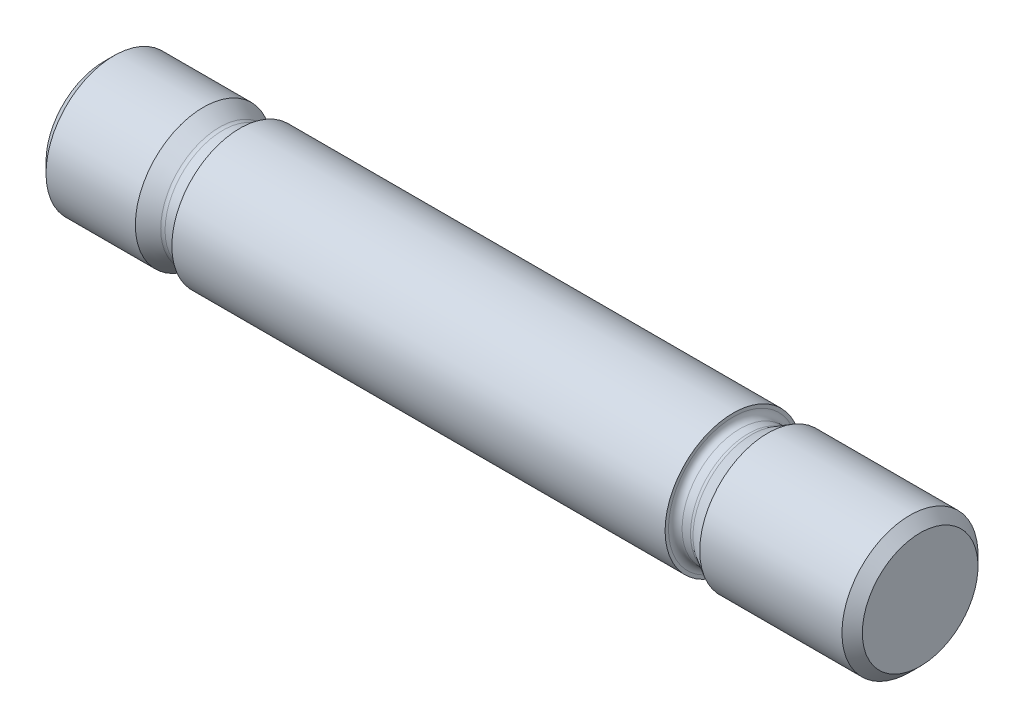
ISO-10303-21;
HEADER;
FILE_DESCRIPTION(('STEP AP214'),'2;1');
FILE_NAME('part.step','',(''),(''),'','','');
FILE_SCHEMA(('AUTOMOTIVE_DESIGN { 1 0 10303 214 1 1 1 1 }'));
ENDSEC;
DATA;
#1=APPLICATION_CONTEXT('core data for automotive mechanical design processes');
#2=APPLICATION_PROTOCOL_DEFINITION('international standard','automotive_design',2000,#1);
#3=PRODUCT_CONTEXT('',#1,'mechanical');
#4=PRODUCT('Part','Part','',(#3));
#5=PRODUCT_RELATED_PRODUCT_CATEGORY('part','',(#4));
#6=PRODUCT_DEFINITION_FORMATION('','',#4);
#7=PRODUCT_DEFINITION_CONTEXT('part definition',#1,'design');
#8=PRODUCT_DEFINITION('design','',#6,#7);
#9=PRODUCT_DEFINITION_SHAPE('','',#8);
#10=(LENGTH_UNIT() NAMED_UNIT(*) SI_UNIT(.MILLI.,.METRE.));
#11=(NAMED_UNIT(*) PLANE_ANGLE_UNIT() SI_UNIT($,.RADIAN.));
#12=(NAMED_UNIT(*) SI_UNIT($,.STERADIAN.) SOLID_ANGLE_UNIT());
#13=UNCERTAINTY_MEASURE_WITH_UNIT(LENGTH_MEASURE(1.E-05),#10,'distance_accuracy_value','');
#14=(GEOMETRIC_REPRESENTATION_CONTEXT(3) GLOBAL_UNCERTAINTY_ASSIGNED_CONTEXT((#13)) GLOBAL_UNIT_ASSIGNED_CONTEXT((#10,
#11,#12)) REPRESENTATION_CONTEXT('',''));
#15=CARTESIAN_POINT('',(0.,0.,0.));
#16=DIRECTION('',(0.,0.,1.));
#17=DIRECTION('',(1.,0.,0.));
#18=AXIS2_PLACEMENT_3D('',#15,#16,#17);
#19=CARTESIAN_POINT('',(0.,8.5,0.));
#20=DIRECTION('',(1.,0.,0.));
#21=DIRECTION('',(0.,0.,-1.));
#22=AXIS2_PLACEMENT_3D('',#19,#20,#21);
#23=PLANE('',#22);
#24=CARTESIAN_POINT('',(0.,0.,0.));
#25=DIRECTION('',(-1.,0.,0.));
#26=DIRECTION('',(0.,0.,1.));
#27=AXIS2_PLACEMENT_3D('',#24,#25,#26);
#28=CIRCLE('',#27,8.5);
#29=CARTESIAN_POINT('',(0.,0.,8.5));
#30=VERTEX_POINT('',#29);
#31=EDGE_CURVE('E82',#30,#30,#28,.T.);
#32=ORIENTED_EDGE('',*,*,#31,.T.);
#33=EDGE_LOOP('',(#32));
#34=FACE_BOUND('',#33,.T.);
#35=ADVANCED_FACE('F30',(#34),#23,.F.);
#36=CARTESIAN_POINT('',(120.,8.5,0.));
#37=DIRECTION('',(1.,0.,0.));
#38=DIRECTION('',(0.,0.,-1.));
#39=AXIS2_PLACEMENT_3D('',#36,#37,#38);
#40=PLANE('',#39);
#41=CARTESIAN_POINT('',(120.,0.,0.));
#42=DIRECTION('',(-1.,0.,0.));
#43=DIRECTION('',(0.,0.,1.));
#44=AXIS2_PLACEMENT_3D('',#41,#42,#43);
#45=CIRCLE('',#44,8.5);
#46=CARTESIAN_POINT('',(120.,0.,8.5));
#47=VERTEX_POINT('',#46);
#48=EDGE_CURVE('E10',#47,#47,#45,.T.);
#49=ORIENTED_EDGE('',*,*,#48,.F.);
#50=EDGE_LOOP('',(#49));
#51=FACE_BOUND('',#50,.T.);
#52=ADVANCED_FACE('F141',(#51),#40,.T.);
#53=CARTESIAN_POINT('',(118.5,0.,0.));
#54=DIRECTION('',(-1.,0.,0.));
#55=DIRECTION('',(0.,0.,1.));
#56=AXIS2_PLACEMENT_3D('',#53,#54,#55);
#57=CONICAL_SURFACE('',#56,10.,0.785398163397427);
#58=ORIENTED_EDGE('',*,*,#48,.T.);
#59=EDGE_LOOP('',(#58));
#60=FACE_BOUND('',#59,.T.);
#61=CARTESIAN_POINT('',(118.5,0.,0.));
#62=DIRECTION('',(-1.,0.,0.));
#63=DIRECTION('',(0.,0.,1.));
#64=AXIS2_PLACEMENT_3D('',#61,#62,#63);
#65=CIRCLE('',#64,10.);
#66=CARTESIAN_POINT('',(118.5,0.,10.));
#67=VERTEX_POINT('',#66);
#68=EDGE_CURVE('E36',#67,#67,#65,.T.);
#69=ORIENTED_EDGE('',*,*,#68,.F.);
#70=EDGE_LOOP('',(#69));
#71=FACE_BOUND('',#70,.T.);
#72=ADVANCED_FACE('F145',(#60,#71),#57,.T.);
#73=CARTESIAN_POINT('',(-3.175,0.,0.));
#74=DIRECTION('',(-1.,0.,0.));
#75=DIRECTION('',(0.,0.,1.));
#76=AXIS2_PLACEMENT_3D('',#73,#74,#75);
#77=CYLINDRICAL_SURFACE('',#76,10.);
#78=ORIENTED_EDGE('',*,*,#68,.T.);
#79=EDGE_LOOP('',(#78));
#80=FACE_BOUND('',#79,.T.);
#81=CARTESIAN_POINT('',(97.6000000000001,0.,0.));
#82=DIRECTION('',(-1.,0.,0.));
#83=DIRECTION('',(0.,0.,1.));
#84=AXIS2_PLACEMENT_3D('',#81,#82,#83);
#85=CIRCLE('',#84,10.);
#86=CARTESIAN_POINT('',(97.6000000000001,0.,10.));
#87=VERTEX_POINT('',#86);
#88=EDGE_CURVE('E40',#87,#87,#85,.T.);
#89=ORIENTED_EDGE('',*,*,#88,.F.);
#90=EDGE_LOOP('',(#89));
#91=FACE_BOUND('',#90,.T.);
#92=ADVANCED_FACE('F150',(#80,#91),#77,.T.);
#93=CARTESIAN_POINT('',(95.2339745962156,0.,0.));
#94=DIRECTION('',(1.,0.,0.));
#95=DIRECTION('',(0.,0.,-1.));
#96=AXIS2_PLACEMENT_3D('',#93,#94,#95);
#97=CONICAL_SURFACE('',#96,8.63397459621557,0.523598775598299);
#98=ORIENTED_EDGE('',*,*,#88,.T.);
#99=EDGE_LOOP('',(#98));
#100=FACE_BOUND('',#99,.T.);
#101=CARTESIAN_POINT('',(95.2339745962156,0.,0.));
#102=DIRECTION('',(-1.,0.,0.));
#103=DIRECTION('',(0.,0.,1.));
#104=AXIS2_PLACEMENT_3D('',#101,#102,#103);
#105=CIRCLE('',#104,8.63397459621557);
#106=CARTESIAN_POINT('',(95.2339745962156,0.,8.63397459621557));
#107=VERTEX_POINT('',#106);
#108=EDGE_CURVE('E44',#107,#107,#105,.T.);
#109=ORIENTED_EDGE('',*,*,#108,.F.);
#110=EDGE_LOOP('',(#109));
#111=FACE_BOUND('',#110,.T.);
#112=ADVANCED_FACE('F155',(#100,#111),#97,.T.);
#113=CARTESIAN_POINT('',(94.7339745962156,0.,0.));
#114=DIRECTION('',(-1.,0.,0.));
#115=DIRECTION('',(0.,0.,1.));
#116=AXIS2_PLACEMENT_3D('',#113,#114,#115);
#117=TOROIDAL_SURFACE('',#116,9.5,0.999999999999999);
#118=ORIENTED_EDGE('',*,*,#108,.T.);
#119=EDGE_LOOP('',(#118));
#120=FACE_BOUND('',#119,.T.);
#121=CARTESIAN_POINT('',(94.7339745962156,0.,0.));
#122=DIRECTION('',(-1.,0.,0.));
#123=DIRECTION('',(0.,0.,1.));
#124=AXIS2_PLACEMENT_3D('',#121,#122,#123);
#125=CIRCLE('',#124,8.5);
#126=CARTESIAN_POINT('',(94.7339745962156,0.,8.5));
#127=VERTEX_POINT('',#126);
#128=EDGE_CURVE('E49',#127,#127,#125,.T.);
#129=ORIENTED_EDGE('',*,*,#128,.F.);
#130=EDGE_LOOP('',(#129));
#131=FACE_BOUND('',#130,.T.);
#132=ADVANCED_FACE('F158',(#120,#131),#117,.F.);
#133=CARTESIAN_POINT('',(-3.175,0.,0.));
#134=DIRECTION('',(-1.,0.,0.));
#135=DIRECTION('',(0.,0.,1.));
#136=AXIS2_PLACEMENT_3D('',#133,#134,#135);
#137=CYLINDRICAL_SURFACE('',#136,8.5);
#138=ORIENTED_EDGE('',*,*,#128,.T.);
#139=EDGE_LOOP('',(#138));
#140=FACE_BOUND('',#139,.T.);
#141=CARTESIAN_POINT('',(93.5019237886467,0.,0.));
#142=DIRECTION('',(-1.,0.,0.));
#143=DIRECTION('',(0.,0.,1.));
#144=AXIS2_PLACEMENT_3D('',#141,#142,#143);
#145=CIRCLE('',#144,8.5);
#146=CARTESIAN_POINT('',(93.5019237886467,0.,8.5));
#147=VERTEX_POINT('',#146);
#148=EDGE_CURVE('E52',#147,#147,#145,.T.);
#149=ORIENTED_EDGE('',*,*,#148,.F.);
#150=EDGE_LOOP('',(#149));
#151=FACE_BOUND('',#150,.T.);
#152=ADVANCED_FACE('F162',(#140,#151),#137,.T.);
#153=CARTESIAN_POINT('',(93.5019237886467,0.,0.));
#154=DIRECTION('',(-1.,0.,0.));
#155=DIRECTION('',(0.,0.,1.));
#156=AXIS2_PLACEMENT_3D('',#153,#154,#155);
#157=TOROIDAL_SURFACE('',#156,9.5,1.00000000000001);
#158=ORIENTED_EDGE('',*,*,#148,.T.);
#159=EDGE_LOOP('',(#158));
#160=FACE_BOUND('',#159,.T.);
#161=CARTESIAN_POINT('',(92.5019237886467,0.,0.));
#162=DIRECTION('',(-1.,0.,0.));
#163=DIRECTION('',(0.,0.,1.));
#164=AXIS2_PLACEMENT_3D('',#161,#162,#163);
#165=CIRCLE('',#164,9.5);
#166=CARTESIAN_POINT('',(92.5019237886467,0.,9.5));
#167=VERTEX_POINT('',#166);
#168=EDGE_CURVE('E55',#167,#167,#165,.T.);
#169=ORIENTED_EDGE('',*,*,#168,.F.);
#170=EDGE_LOOP('',(#169));
#171=FACE_BOUND('',#170,.T.);
#172=ADVANCED_FACE('F137',(#160,#171),#157,.F.);
#173=CARTESIAN_POINT('',(92.5019237886467,10.,0.));
#174=DIRECTION('',(1.,0.,0.));
#175=DIRECTION('',(0.,0.,-1.));
#176=AXIS2_PLACEMENT_3D('',#173,#174,#175);
#177=PLANE('',#176);
#178=ORIENTED_EDGE('',*,*,#168,.T.);
#179=EDGE_LOOP('',(#178));
#180=FACE_BOUND('',#179,.T.);
#181=CARTESIAN_POINT('',(92.5019237886467,0.,0.));
#182=DIRECTION('',(-1.,0.,0.));
#183=DIRECTION('',(0.,0.,1.));
#184=AXIS2_PLACEMENT_3D('',#181,#182,#183);
#185=CIRCLE('',#184,10.);
#186=CARTESIAN_POINT('',(92.5019237886467,0.,10.));
#187=VERTEX_POINT('',#186);
#188=EDGE_CURVE('E58',#187,#187,#185,.T.);
#189=ORIENTED_EDGE('',*,*,#188,.F.);
#190=EDGE_LOOP('',(#189));
#191=FACE_BOUND('',#190,.T.);
#192=ADVANCED_FACE('F131',(#180,#191),#177,.T.);
#193=CARTESIAN_POINT('',(-3.175,0.,0.));
#194=DIRECTION('',(-1.,0.,0.));
#195=DIRECTION('',(0.,0.,1.));
#196=AXIS2_PLACEMENT_3D('',#193,#194,#195);
#197=CYLINDRICAL_SURFACE('',#196,10.);
#198=ORIENTED_EDGE('',*,*,#188,.T.);
#199=EDGE_LOOP('',(#198));
#200=FACE_BOUND('',#199,.T.);
#201=CARTESIAN_POINT('',(20.,0.,0.));
#202=DIRECTION('',(-1.,0.,0.));
#203=DIRECTION('',(0.,0.,1.));
#204=AXIS2_PLACEMENT_3D('',#201,#202,#203);
#205=CIRCLE('',#204,10.);
#206=CARTESIAN_POINT('',(20.,0.,10.));
#207=VERTEX_POINT('',#206);
#208=EDGE_CURVE('E61',#207,#207,#205,.T.);
#209=ORIENTED_EDGE('',*,*,#208,.F.);
#210=EDGE_LOOP('',(#209));
#211=FACE_BOUND('',#210,.T.);
#212=ADVANCED_FACE('F126',(#200,#211),#197,.T.);
#213=CARTESIAN_POINT('',(20.,10.,0.));
#214=DIRECTION('',(1.,0.,0.));
#215=DIRECTION('',(0.,0.,-1.));
#216=AXIS2_PLACEMENT_3D('',#213,#214,#215);
#217=PLANE('',#216);
#218=CARTESIAN_POINT('',(20.,0.,0.));
#219=DIRECTION('',(-1.,0.,0.));
#220=DIRECTION('',(0.,0.,1.));
#221=AXIS2_PLACEMENT_3D('',#218,#219,#220);
#222=CIRCLE('',#221,9.50000000000001);
#223=CARTESIAN_POINT('',(20.,0.,9.50000000000001));
#224=VERTEX_POINT('',#223);
#225=EDGE_CURVE('E64',#224,#224,#222,.T.);
#226=ORIENTED_EDGE('',*,*,#225,.F.);
#227=EDGE_LOOP('',(#226));
#228=FACE_BOUND('',#227,.T.);
#229=ORIENTED_EDGE('',*,*,#208,.T.);
#230=EDGE_LOOP('',(#229));
#231=FACE_BOUND('',#230,.T.);
#232=ADVANCED_FACE('F120',(#228,#231),#217,.F.);
#233=CARTESIAN_POINT('',(19.0000000000001,0.,0.));
#234=DIRECTION('',(-1.,0.,0.));
#235=DIRECTION('',(0.,0.,1.));
#236=AXIS2_PLACEMENT_3D('',#233,#234,#235);
#237=TOROIDAL_SURFACE('',#236,9.5,0.999999999999997);
#238=CARTESIAN_POINT('',(19.0000000000001,0.,0.));
#239=DIRECTION('',(-1.,0.,0.));
#240=DIRECTION('',(0.,0.,1.));
#241=AXIS2_PLACEMENT_3D('',#238,#239,#240);
#242=CIRCLE('',#241,8.50000000000001);
#243=CARTESIAN_POINT('',(19.0000000000001,0.,8.50000000000001));
#244=VERTEX_POINT('',#243);
#245=EDGE_CURVE('E67',#244,#244,#242,.T.);
#246=ORIENTED_EDGE('',*,*,#245,.F.);
#247=EDGE_LOOP('',(#246));
#248=FACE_BOUND('',#247,.T.);
#249=ORIENTED_EDGE('',*,*,#225,.T.);
#250=EDGE_LOOP('',(#249));
#251=FACE_BOUND('',#250,.T.);
#252=ADVANCED_FACE('F114',(#248,#251),#237,.F.);
#253=CARTESIAN_POINT('',(-3.175,0.,0.));
#254=DIRECTION('',(-1.,0.,0.));
#255=DIRECTION('',(0.,0.,1.));
#256=AXIS2_PLACEMENT_3D('',#253,#254,#255);
#257=CYLINDRICAL_SURFACE('',#256,8.5);
#258=CARTESIAN_POINT('',(17.5,0.,0.));
#259=DIRECTION('',(-1.,0.,0.));
#260=DIRECTION('',(0.,0.,1.));
#261=AXIS2_PLACEMENT_3D('',#258,#259,#260);
#262=CIRCLE('',#261,8.5);
#263=CARTESIAN_POINT('',(17.5,0.,8.5));
#264=VERTEX_POINT('',#263);
#265=EDGE_CURVE('E70',#264,#264,#262,.T.);
#266=ORIENTED_EDGE('',*,*,#265,.F.);
#267=EDGE_LOOP('',(#266));
#268=FACE_BOUND('',#267,.T.);
#269=ORIENTED_EDGE('',*,*,#245,.T.);
#270=EDGE_LOOP('',(#269));
#271=FACE_BOUND('',#270,.T.);
#272=ADVANCED_FACE('F108',(#268,#271),#257,.T.);
#273=CARTESIAN_POINT('',(17.5,0.,0.));
#274=DIRECTION('',(-1.,0.,0.));
#275=DIRECTION('',(0.,0.,1.));
#276=AXIS2_PLACEMENT_3D('',#273,#274,#275);
#277=TOROIDAL_SURFACE('',#276,9.5,1.);
#278=CARTESIAN_POINT('',(17.,0.,0.));
#279=DIRECTION('',(-1.,0.,0.));
#280=DIRECTION('',(0.,0.,1.));
#281=AXIS2_PLACEMENT_3D('',#278,#279,#280);
#282=CIRCLE('',#281,8.63397459621556);
#283=CARTESIAN_POINT('',(17.,0.,8.63397459621556));
#284=VERTEX_POINT('',#283);
#285=EDGE_CURVE('E73',#284,#284,#282,.T.);
#286=ORIENTED_EDGE('',*,*,#285,.F.);
#287=EDGE_LOOP('',(#286));
#288=FACE_BOUND('',#287,.T.);
#289=ORIENTED_EDGE('',*,*,#265,.T.);
#290=EDGE_LOOP('',(#289));
#291=FACE_BOUND('',#290,.T.);
#292=ADVANCED_FACE('F102',(#288,#291),#277,.F.);
#293=CARTESIAN_POINT('',(17.,0.,0.));
#294=DIRECTION('',(-1.,0.,0.));
#295=DIRECTION('',(0.,0.,1.));
#296=AXIS2_PLACEMENT_3D('',#293,#294,#295);
#297=CONICAL_SURFACE('',#296,8.63397459621556,0.523598775598301);
#298=CARTESIAN_POINT('',(14.6339745962156,0.,0.));
#299=DIRECTION('',(-1.,0.,0.));
#300=DIRECTION('',(0.,0.,1.));
#301=AXIS2_PLACEMENT_3D('',#298,#299,#300);
#302=CIRCLE('',#301,10.);
#303=CARTESIAN_POINT('',(14.6339745962156,0.,10.));
#304=VERTEX_POINT('',#303);
#305=EDGE_CURVE('E76',#304,#304,#302,.T.);
#306=ORIENTED_EDGE('',*,*,#305,.F.);
#307=EDGE_LOOP('',(#306));
#308=FACE_BOUND('',#307,.T.);
#309=ORIENTED_EDGE('',*,*,#285,.T.);
#310=EDGE_LOOP('',(#309));
#311=FACE_BOUND('',#310,.T.);
#312=ADVANCED_FACE('F96',(#308,#311),#297,.T.);
#313=CARTESIAN_POINT('',(-3.175,0.,0.));
#314=DIRECTION('',(-1.,0.,0.));
#315=DIRECTION('',(0.,0.,1.));
#316=AXIS2_PLACEMENT_3D('',#313,#314,#315);
#317=CYLINDRICAL_SURFACE('',#316,10.);
#318=CARTESIAN_POINT('',(1.49999999999995,0.,0.));
#319=DIRECTION('',(-1.,0.,0.));
#320=DIRECTION('',(0.,0.,1.));
#321=AXIS2_PLACEMENT_3D('',#318,#319,#320);
#322=CIRCLE('',#321,10.);
#323=CARTESIAN_POINT('',(1.49999999999995,0.,10.));
#324=VERTEX_POINT('',#323);
#325=EDGE_CURVE('E79',#324,#324,#322,.T.);
#326=ORIENTED_EDGE('',*,*,#325,.F.);
#327=EDGE_LOOP('',(#326));
#328=FACE_BOUND('',#327,.T.);
#329=ORIENTED_EDGE('',*,*,#305,.T.);
#330=EDGE_LOOP('',(#329));
#331=FACE_BOUND('',#330,.T.);
#332=ADVANCED_FACE('F90',(#328,#331),#317,.T.);
#333=CARTESIAN_POINT('',(1.49999999999995,0.,0.));
#334=DIRECTION('',(1.,0.,0.));
#335=DIRECTION('',(0.,0.,-1.));
#336=AXIS2_PLACEMENT_3D('',#333,#334,#335);
#337=CONICAL_SURFACE('',#336,10.,0.785398163397483);
#338=ORIENTED_EDGE('',*,*,#31,.F.);
#339=EDGE_LOOP('',(#338));
#340=FACE_BOUND('',#339,.T.);
#341=ORIENTED_EDGE('',*,*,#325,.T.);
#342=EDGE_LOOP('',(#341));
#343=FACE_BOUND('',#342,.T.);
#344=ADVANCED_FACE('F87',(#340,#343),#337,.T.);
#345=CLOSED_SHELL('',(#35,#52,#72,#92,#112,#132,#152,#172,#192,#212,#232,#252,#272,#292,#312,
#332,#344));
#346=MANIFOLD_SOLID_BREP('B2',#345);
#347=ADVANCED_BREP_SHAPE_REPRESENTATION('',(#18,#346),#14);
#348=SHAPE_DEFINITION_REPRESENTATION(#9,#347);
ENDSEC;
END-ISO-10303-21;
